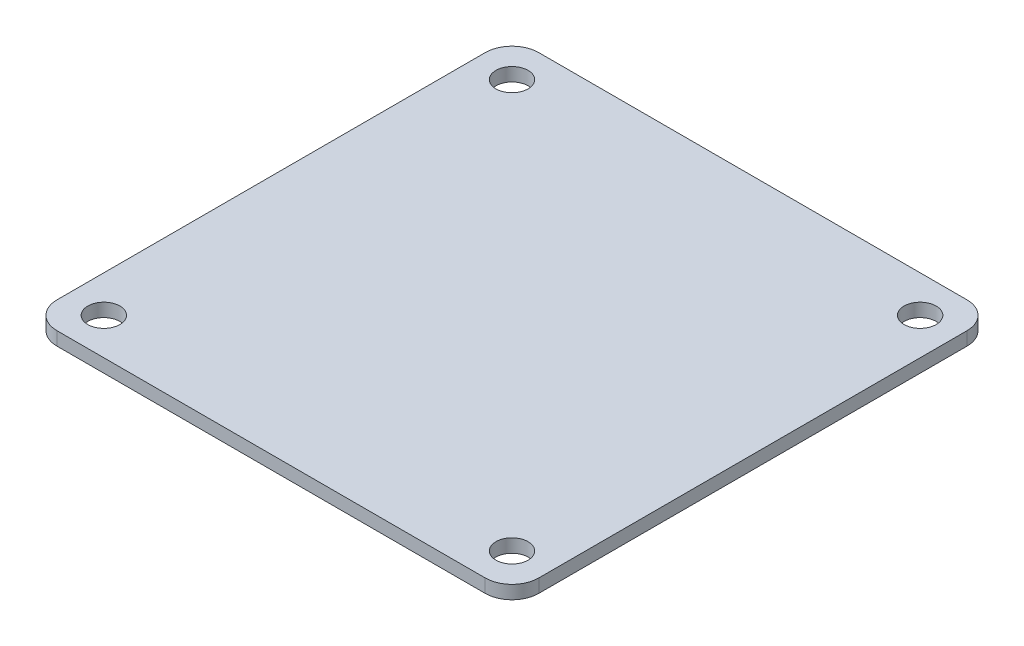
ISO-10303-21;
HEADER;
FILE_DESCRIPTION(('STEP AP214'),'2;1');
FILE_NAME('part.step','',(''),(''),'','','');
FILE_SCHEMA(('AUTOMOTIVE_DESIGN { 1 0 10303 214 1 1 1 1 }'));
ENDSEC;
DATA;
#1=APPLICATION_CONTEXT('core data for automotive mechanical design processes');
#2=APPLICATION_PROTOCOL_DEFINITION('international standard','automotive_design',2000,#1);
#3=PRODUCT_CONTEXT('',#1,'mechanical');
#4=PRODUCT('Part','Part','',(#3));
#5=PRODUCT_RELATED_PRODUCT_CATEGORY('part','',(#4));
#6=PRODUCT_DEFINITION_FORMATION('','',#4);
#7=PRODUCT_DEFINITION_CONTEXT('part definition',#1,'design');
#8=PRODUCT_DEFINITION('design','',#6,#7);
#9=PRODUCT_DEFINITION_SHAPE('','',#8);
#10=(LENGTH_UNIT() NAMED_UNIT(*) SI_UNIT(.MILLI.,.METRE.));
#11=(NAMED_UNIT(*) PLANE_ANGLE_UNIT() SI_UNIT($,.RADIAN.));
#12=(NAMED_UNIT(*) SI_UNIT($,.STERADIAN.) SOLID_ANGLE_UNIT());
#13=UNCERTAINTY_MEASURE_WITH_UNIT(LENGTH_MEASURE(1.E-05),#10,'distance_accuracy_value','');
#14=(GEOMETRIC_REPRESENTATION_CONTEXT(3) GLOBAL_UNCERTAINTY_ASSIGNED_CONTEXT((#13)) GLOBAL_UNIT_ASSIGNED_CONTEXT((#10,
#11,#12)) REPRESENTATION_CONTEXT('',''));
#15=CARTESIAN_POINT('',(0.,0.,0.));
#16=DIRECTION('',(0.,0.,1.));
#17=DIRECTION('',(1.,0.,0.));
#18=AXIS2_PLACEMENT_3D('',#15,#16,#17);
#19=CARTESIAN_POINT('',(-18.,1.,-18.));
#20=DIRECTION('',(1.,0.,0.));
#21=DIRECTION('',(0.,0.,-1.));
#22=AXIS2_PLACEMENT_3D('',#19,#20,#21);
#23=PLANE('',#22);
#24=DIRECTION('',(0.,0.,1.));
#25=VECTOR('',#24,1.);
#26=CARTESIAN_POINT('',(-18.,0.,-18.));
#27=LINE('',#26,#25);
#28=CARTESIAN_POINT('',(-18.,0.,-16.));
#29=VERTEX_POINT('',#28);
#30=CARTESIAN_POINT('',(-18.,0.,16.));
#31=VERTEX_POINT('',#30);
#32=EDGE_CURVE('E158',#29,#31,#27,.T.);
#33=ORIENTED_EDGE('',*,*,#32,.T.);
#34=DIRECTION('',(0.,-1.,0.));
#35=VECTOR('',#34,1.);
#36=CARTESIAN_POINT('',(-18.,1.,16.));
#37=LINE('',#36,#35);
#38=CARTESIAN_POINT('',(-18.,1.,16.));
#39=VERTEX_POINT('',#38);
#40=EDGE_CURVE('E11',#31,#39,#37,.F.);
#41=ORIENTED_EDGE('',*,*,#40,.T.);
#42=DIRECTION('',(0.,0.,1.));
#43=VECTOR('',#42,1.);
#44=CARTESIAN_POINT('',(-18.,1.,-18.));
#45=LINE('',#44,#43);
#46=CARTESIAN_POINT('',(-18.,1.,-16.));
#47=VERTEX_POINT('',#46);
#48=EDGE_CURVE('E126',#47,#39,#45,.T.);
#49=ORIENTED_EDGE('',*,*,#48,.F.);
#50=DIRECTION('',(0.,-1.,0.));
#51=VECTOR('',#50,1.);
#52=CARTESIAN_POINT('',(-18.,1.,-16.));
#53=LINE('',#52,#51);
#54=EDGE_CURVE('E42',#47,#29,#53,.T.);
#55=ORIENTED_EDGE('',*,*,#54,.T.);
#56=EDGE_LOOP('',(#33,#41,#49,#55));
#57=FACE_BOUND('',#56,.T.);
#58=ADVANCED_FACE('F34',(#57),#23,.F.);
#59=CARTESIAN_POINT('',(18.,1.,18.));
#60=DIRECTION('',(0.,0.,-1.));
#61=DIRECTION('',(-1.,0.,0.));
#62=AXIS2_PLACEMENT_3D('',#59,#60,#61);
#63=PLANE('',#62);
#64=DIRECTION('',(1.,0.,0.));
#65=VECTOR('',#64,1.);
#66=CARTESIAN_POINT('',(18.,0.,18.));
#67=LINE('',#66,#65);
#68=CARTESIAN_POINT('',(-16.,0.,18.));
#69=VERTEX_POINT('',#68);
#70=CARTESIAN_POINT('',(16.,0.,18.));
#71=VERTEX_POINT('',#70);
#72=EDGE_CURVE('E131',#69,#71,#67,.T.);
#73=ORIENTED_EDGE('',*,*,#72,.T.);
#74=DIRECTION('',(0.,-1.,0.));
#75=VECTOR('',#74,1.);
#76=CARTESIAN_POINT('',(16.,1.,18.));
#77=LINE('',#76,#75);
#78=CARTESIAN_POINT('',(16.,1.,18.));
#79=VERTEX_POINT('',#78);
#80=EDGE_CURVE('E49',#71,#79,#77,.F.);
#81=ORIENTED_EDGE('',*,*,#80,.T.);
#82=DIRECTION('',(1.,0.,0.));
#83=VECTOR('',#82,1.);
#84=CARTESIAN_POINT('',(18.,1.,18.));
#85=LINE('',#84,#83);
#86=CARTESIAN_POINT('',(-16.,1.,18.));
#87=VERTEX_POINT('',#86);
#88=EDGE_CURVE('E129',#87,#79,#85,.T.);
#89=ORIENTED_EDGE('',*,*,#88,.F.);
#90=DIRECTION('',(0.,-1.,0.));
#91=VECTOR('',#90,1.);
#92=CARTESIAN_POINT('',(-16.,1.,18.));
#93=LINE('',#92,#91);
#94=EDGE_CURVE('E150',#87,#69,#93,.T.);
#95=ORIENTED_EDGE('',*,*,#94,.T.);
#96=EDGE_LOOP('',(#73,#81,#89,#95));
#97=FACE_BOUND('',#96,.T.);
#98=ADVANCED_FACE('F213',(#97),#63,.F.);
#99=CARTESIAN_POINT('',(18.,1.,-18.));
#100=DIRECTION('',(-1.,0.,0.));
#101=DIRECTION('',(0.,0.,1.));
#102=AXIS2_PLACEMENT_3D('',#99,#100,#101);
#103=PLANE('',#102);
#104=DIRECTION('',(0.,0.,-1.));
#105=VECTOR('',#104,1.);
#106=CARTESIAN_POINT('',(18.,0.,-18.));
#107=LINE('',#106,#105);
#108=CARTESIAN_POINT('',(18.,0.,16.));
#109=VERTEX_POINT('',#108);
#110=CARTESIAN_POINT('',(18.,0.,-16.));
#111=VERTEX_POINT('',#110);
#112=EDGE_CURVE('E127',#109,#111,#107,.T.);
#113=ORIENTED_EDGE('',*,*,#112,.T.);
#114=DIRECTION('',(0.,-1.,0.));
#115=VECTOR('',#114,1.);
#116=CARTESIAN_POINT('',(18.,1.,-16.));
#117=LINE('',#116,#115);
#118=CARTESIAN_POINT('',(18.,1.,-16.));
#119=VERTEX_POINT('',#118);
#120=EDGE_CURVE('E105',#111,#119,#117,.F.);
#121=ORIENTED_EDGE('',*,*,#120,.T.);
#122=DIRECTION('',(0.,0.,-1.));
#123=VECTOR('',#122,1.);
#124=CARTESIAN_POINT('',(18.,1.,-18.));
#125=LINE('',#124,#123);
#126=CARTESIAN_POINT('',(18.,1.,16.));
#127=VERTEX_POINT('',#126);
#128=EDGE_CURVE('E170',#127,#119,#125,.T.);
#129=ORIENTED_EDGE('',*,*,#128,.F.);
#130=DIRECTION('',(0.,-1.,0.));
#131=VECTOR('',#130,1.);
#132=CARTESIAN_POINT('',(18.,1.,16.));
#133=LINE('',#132,#131);
#134=EDGE_CURVE('E110',#127,#109,#133,.T.);
#135=ORIENTED_EDGE('',*,*,#134,.T.);
#136=EDGE_LOOP('',(#113,#121,#129,#135));
#137=FACE_BOUND('',#136,.T.);
#138=ADVANCED_FACE('F210',(#137),#103,.F.);
#139=CARTESIAN_POINT('',(18.,1.,-18.));
#140=DIRECTION('',(0.,0.,1.));
#141=DIRECTION('',(1.,0.,0.));
#142=AXIS2_PLACEMENT_3D('',#139,#140,#141);
#143=PLANE('',#142);
#144=DIRECTION('',(-1.,0.,0.));
#145=VECTOR('',#144,1.);
#146=CARTESIAN_POINT('',(18.,1.,-18.));
#147=LINE('',#146,#145);
#148=CARTESIAN_POINT('',(16.,1.,-18.));
#149=VERTEX_POINT('',#148);
#150=CARTESIAN_POINT('',(-16.,1.,-18.));
#151=VERTEX_POINT('',#150);
#152=EDGE_CURVE('E120',#149,#151,#147,.T.);
#153=ORIENTED_EDGE('',*,*,#152,.F.);
#154=DIRECTION('',(0.,-1.,0.));
#155=VECTOR('',#154,1.);
#156=CARTESIAN_POINT('',(16.,1.,-18.));
#157=LINE('',#156,#155);
#158=CARTESIAN_POINT('',(16.,0.,-18.));
#159=VERTEX_POINT('',#158);
#160=EDGE_CURVE('E104',#149,#159,#157,.T.);
#161=ORIENTED_EDGE('',*,*,#160,.T.);
#162=DIRECTION('',(-1.,0.,0.));
#163=VECTOR('',#162,1.);
#164=CARTESIAN_POINT('',(18.,0.,-18.));
#165=LINE('',#164,#163);
#166=CARTESIAN_POINT('',(-16.,0.,-18.));
#167=VERTEX_POINT('',#166);
#168=EDGE_CURVE('E117',#159,#167,#165,.T.);
#169=ORIENTED_EDGE('',*,*,#168,.T.);
#170=DIRECTION('',(0.,-1.,0.));
#171=VECTOR('',#170,1.);
#172=CARTESIAN_POINT('',(-16.,1.,-18.));
#173=LINE('',#172,#171);
#174=EDGE_CURVE('E122',#167,#151,#173,.F.);
#175=ORIENTED_EDGE('',*,*,#174,.T.);
#176=EDGE_LOOP('',(#153,#161,#169,#175));
#177=FACE_BOUND('',#176,.T.);
#178=ADVANCED_FACE('F116',(#177),#143,.F.);
#179=CARTESIAN_POINT('',(0.,1.,0.));
#180=DIRECTION('',(0.,-1.,0.));
#181=DIRECTION('',(0.,0.,-1.));
#182=AXIS2_PLACEMENT_3D('',#179,#180,#181);
#183=PLANE('',#182);
#184=CARTESIAN_POINT('',(-15.25,1.,-15.25));
#185=DIRECTION('',(0.,1.,0.));
#186=DIRECTION('',(0.,0.,1.));
#187=AXIS2_PLACEMENT_3D('',#184,#185,#186);
#188=CIRCLE('',#187,1.19999999999999);
#189=CARTESIAN_POINT('',(-15.25,1.,-14.05));
#190=VERTEX_POINT('',#189);
#191=EDGE_CURVE('E191',#190,#190,#188,.T.);
#192=ORIENTED_EDGE('',*,*,#191,.F.);
#193=EDGE_LOOP('',(#192));
#194=FACE_BOUND('',#193,.T.);
#195=CARTESIAN_POINT('',(15.25,1.,-15.25));
#196=DIRECTION('',(0.,1.,0.));
#197=DIRECTION('',(0.,0.,1.));
#198=AXIS2_PLACEMENT_3D('',#195,#196,#197);
#199=CIRCLE('',#198,1.19999999999999);
#200=CARTESIAN_POINT('',(15.25,1.,-14.05));
#201=VERTEX_POINT('',#200);
#202=EDGE_CURVE('E185',#201,#201,#199,.T.);
#203=ORIENTED_EDGE('',*,*,#202,.F.);
#204=EDGE_LOOP('',(#203));
#205=FACE_BOUND('',#204,.T.);
#206=CARTESIAN_POINT('',(15.25,1.,15.25));
#207=DIRECTION('',(0.,1.,0.));
#208=DIRECTION('',(0.,0.,1.));
#209=AXIS2_PLACEMENT_3D('',#206,#207,#208);
#210=CIRCLE('',#209,1.19999999999999);
#211=CARTESIAN_POINT('',(15.25,1.,16.45));
#212=VERTEX_POINT('',#211);
#213=EDGE_CURVE('E179',#212,#212,#210,.T.);
#214=ORIENTED_EDGE('',*,*,#213,.F.);
#215=EDGE_LOOP('',(#214));
#216=FACE_BOUND('',#215,.T.);
#217=CARTESIAN_POINT('',(-15.25,1.,15.25));
#218=DIRECTION('',(0.,1.,0.));
#219=DIRECTION('',(0.,0.,1.));
#220=AXIS2_PLACEMENT_3D('',#217,#218,#219);
#221=CIRCLE('',#220,1.19999999999999);
#222=CARTESIAN_POINT('',(-15.25,1.,16.45));
#223=VERTEX_POINT('',#222);
#224=EDGE_CURVE('E166',#223,#223,#221,.T.);
#225=ORIENTED_EDGE('',*,*,#224,.F.);
#226=EDGE_LOOP('',(#225));
#227=FACE_BOUND('',#226,.T.);
#228=ORIENTED_EDGE('',*,*,#128,.T.);
#229=CARTESIAN_POINT('',(16.,1.,-16.));
#230=DIRECTION('',(0.,-1.,0.));
#231=DIRECTION('',(0.,0.,-1.));
#232=AXIS2_PLACEMENT_3D('',#229,#230,#231);
#233=CIRCLE('',#232,2.);
#234=EDGE_CURVE('E148',#119,#149,#233,.F.);
#235=ORIENTED_EDGE('',*,*,#234,.T.);
#236=ORIENTED_EDGE('',*,*,#152,.T.);
#237=CARTESIAN_POINT('',(-16.,1.,-16.));
#238=DIRECTION('',(0.,-1.,0.));
#239=DIRECTION('',(0.,0.,-1.));
#240=AXIS2_PLACEMENT_3D('',#237,#238,#239);
#241=CIRCLE('',#240,2.);
#242=EDGE_CURVE('E143',#151,#47,#241,.F.);
#243=ORIENTED_EDGE('',*,*,#242,.T.);
#244=ORIENTED_EDGE('',*,*,#48,.T.);
#245=CARTESIAN_POINT('',(-16.,1.,16.));
#246=DIRECTION('',(0.,-1.,0.));
#247=DIRECTION('',(0.,0.,-1.));
#248=AXIS2_PLACEMENT_3D('',#245,#246,#247);
#249=CIRCLE('',#248,2.);
#250=EDGE_CURVE('E56',#39,#87,#249,.F.);
#251=ORIENTED_EDGE('',*,*,#250,.T.);
#252=ORIENTED_EDGE('',*,*,#88,.T.);
#253=CARTESIAN_POINT('',(16.,1.,16.));
#254=DIRECTION('',(0.,-1.,0.));
#255=DIRECTION('',(0.,0.,-1.));
#256=AXIS2_PLACEMENT_3D('',#253,#254,#255);
#257=CIRCLE('',#256,2.);
#258=EDGE_CURVE('E146',#79,#127,#257,.F.);
#259=ORIENTED_EDGE('',*,*,#258,.T.);
#260=EDGE_LOOP('',(#228,#235,#236,#243,#244,#251,#252,#259));
#261=FACE_BOUND('',#260,.T.);
#262=ADVANCED_FACE('F197',(#194,#205,#216,#227,#261),#183,.F.);
#263=CARTESIAN_POINT('',(0.,0.,0.));
#264=DIRECTION('',(0.,-1.,0.));
#265=DIRECTION('',(0.,0.,-1.));
#266=AXIS2_PLACEMENT_3D('',#263,#264,#265);
#267=PLANE('',#266);
#268=CARTESIAN_POINT('',(-15.25,0.,-15.25));
#269=DIRECTION('',(0.,1.,0.));
#270=DIRECTION('',(0.,0.,1.));
#271=AXIS2_PLACEMENT_3D('',#268,#269,#270);
#272=CIRCLE('',#271,1.2);
#273=CARTESIAN_POINT('',(-15.25,0.,-14.05));
#274=VERTEX_POINT('',#273);
#275=EDGE_CURVE('E188',#274,#274,#272,.T.);
#276=ORIENTED_EDGE('',*,*,#275,.T.);
#277=EDGE_LOOP('',(#276));
#278=FACE_BOUND('',#277,.T.);
#279=CARTESIAN_POINT('',(15.25,0.,-15.25));
#280=DIRECTION('',(0.,1.,0.));
#281=DIRECTION('',(0.,0.,1.));
#282=AXIS2_PLACEMENT_3D('',#279,#280,#281);
#283=CIRCLE('',#282,1.2);
#284=CARTESIAN_POINT('',(15.25,0.,-14.05));
#285=VERTEX_POINT('',#284);
#286=EDGE_CURVE('E182',#285,#285,#283,.T.);
#287=ORIENTED_EDGE('',*,*,#286,.T.);
#288=EDGE_LOOP('',(#287));
#289=FACE_BOUND('',#288,.T.);
#290=CARTESIAN_POINT('',(15.25,0.,15.25));
#291=DIRECTION('',(0.,1.,0.));
#292=DIRECTION('',(0.,0.,1.));
#293=AXIS2_PLACEMENT_3D('',#290,#291,#292);
#294=CIRCLE('',#293,1.2);
#295=CARTESIAN_POINT('',(15.25,0.,16.45));
#296=VERTEX_POINT('',#295);
#297=EDGE_CURVE('E176',#296,#296,#294,.T.);
#298=ORIENTED_EDGE('',*,*,#297,.T.);
#299=EDGE_LOOP('',(#298));
#300=FACE_BOUND('',#299,.T.);
#301=CARTESIAN_POINT('',(-15.25,0.,15.25));
#302=DIRECTION('',(0.,1.,0.));
#303=DIRECTION('',(0.,0.,1.));
#304=AXIS2_PLACEMENT_3D('',#301,#302,#303);
#305=CIRCLE('',#304,1.2);
#306=CARTESIAN_POINT('',(-15.25,0.,16.45));
#307=VERTEX_POINT('',#306);
#308=EDGE_CURVE('E163',#307,#307,#305,.T.);
#309=ORIENTED_EDGE('',*,*,#308,.T.);
#310=EDGE_LOOP('',(#309));
#311=FACE_BOUND('',#310,.T.);
#312=ORIENTED_EDGE('',*,*,#168,.F.);
#313=CARTESIAN_POINT('',(16.,0.,-16.));
#314=DIRECTION('',(0.,-1.,0.));
#315=DIRECTION('',(0.,0.,-1.));
#316=AXIS2_PLACEMENT_3D('',#313,#314,#315);
#317=CIRCLE('',#316,2.);
#318=EDGE_CURVE('E100',#159,#111,#317,.T.);
#319=ORIENTED_EDGE('',*,*,#318,.T.);
#320=ORIENTED_EDGE('',*,*,#112,.F.);
#321=CARTESIAN_POINT('',(16.,0.,16.));
#322=DIRECTION('',(0.,-1.,0.));
#323=DIRECTION('',(0.,0.,-1.));
#324=AXIS2_PLACEMENT_3D('',#321,#322,#323);
#325=CIRCLE('',#324,2.);
#326=EDGE_CURVE('E111',#109,#71,#325,.T.);
#327=ORIENTED_EDGE('',*,*,#326,.T.);
#328=ORIENTED_EDGE('',*,*,#72,.F.);
#329=CARTESIAN_POINT('',(-16.,0.,16.));
#330=DIRECTION('',(0.,-1.,0.));
#331=DIRECTION('',(0.,0.,-1.));
#332=AXIS2_PLACEMENT_3D('',#329,#330,#331);
#333=CIRCLE('',#332,2.);
#334=EDGE_CURVE('E137',#69,#31,#333,.T.);
#335=ORIENTED_EDGE('',*,*,#334,.T.);
#336=ORIENTED_EDGE('',*,*,#32,.F.);
#337=CARTESIAN_POINT('',(-16.,0.,-16.));
#338=DIRECTION('',(0.,-1.,0.));
#339=DIRECTION('',(0.,0.,-1.));
#340=AXIS2_PLACEMENT_3D('',#337,#338,#339);
#341=CIRCLE('',#340,2.);
#342=EDGE_CURVE('E121',#29,#167,#341,.T.);
#343=ORIENTED_EDGE('',*,*,#342,.T.);
#344=EDGE_LOOP('',(#312,#319,#320,#327,#328,#335,#336,#343));
#345=FACE_BOUND('',#344,.T.);
#346=ADVANCED_FACE('F124',(#278,#289,#300,#311,#345),#267,.T.);
#347=CARTESIAN_POINT('',(-15.25,1.,15.25));
#348=DIRECTION('',(0.,1.,0.));
#349=DIRECTION('',(0.,0.,1.));
#350=AXIS2_PLACEMENT_3D('',#347,#348,#349);
#351=CYLINDRICAL_SURFACE('',#350,1.19999999999999);
#352=ORIENTED_EDGE('',*,*,#308,.F.);
#353=EDGE_LOOP('',(#352));
#354=FACE_BOUND('',#353,.T.);
#355=ORIENTED_EDGE('',*,*,#224,.T.);
#356=EDGE_LOOP('',(#355));
#357=FACE_BOUND('',#356,.T.);
#358=ADVANCED_FACE('F279',(#354,#357),#351,.F.);
#359=CARTESIAN_POINT('',(15.25,1.,15.25));
#360=DIRECTION('',(0.,1.,0.));
#361=DIRECTION('',(0.,0.,1.));
#362=AXIS2_PLACEMENT_3D('',#359,#360,#361);
#363=CYLINDRICAL_SURFACE('',#362,1.19999999999999);
#364=ORIENTED_EDGE('',*,*,#297,.F.);
#365=EDGE_LOOP('',(#364));
#366=FACE_BOUND('',#365,.T.);
#367=ORIENTED_EDGE('',*,*,#213,.T.);
#368=EDGE_LOOP('',(#367));
#369=FACE_BOUND('',#368,.T.);
#370=ADVANCED_FACE('F270',(#366,#369),#363,.F.);
#371=CARTESIAN_POINT('',(15.25,1.,-15.25));
#372=DIRECTION('',(0.,1.,0.));
#373=DIRECTION('',(0.,0.,1.));
#374=AXIS2_PLACEMENT_3D('',#371,#372,#373);
#375=CYLINDRICAL_SURFACE('',#374,1.19999999999999);
#376=ORIENTED_EDGE('',*,*,#286,.F.);
#377=EDGE_LOOP('',(#376));
#378=FACE_BOUND('',#377,.T.);
#379=ORIENTED_EDGE('',*,*,#202,.T.);
#380=EDGE_LOOP('',(#379));
#381=FACE_BOUND('',#380,.T.);
#382=ADVANCED_FACE('F261',(#378,#381),#375,.F.);
#383=CARTESIAN_POINT('',(-15.25,1.,-15.25));
#384=DIRECTION('',(0.,1.,0.));
#385=DIRECTION('',(0.,0.,1.));
#386=AXIS2_PLACEMENT_3D('',#383,#384,#385);
#387=CYLINDRICAL_SURFACE('',#386,1.19999999999999);
#388=ORIENTED_EDGE('',*,*,#275,.F.);
#389=EDGE_LOOP('',(#388));
#390=FACE_BOUND('',#389,.T.);
#391=ORIENTED_EDGE('',*,*,#191,.T.);
#392=EDGE_LOOP('',(#391));
#393=FACE_BOUND('',#392,.T.);
#394=ADVANCED_FACE('F195',(#390,#393),#387,.F.);
#395=CARTESIAN_POINT('',(16.,1.,-16.));
#396=DIRECTION('',(0.,-1.,0.));
#397=DIRECTION('',(0.,0.,-1.));
#398=AXIS2_PLACEMENT_3D('',#395,#396,#397);
#399=CYLINDRICAL_SURFACE('',#398,2.);
#400=ORIENTED_EDGE('',*,*,#234,.F.);
#401=ORIENTED_EDGE('',*,*,#120,.F.);
#402=ORIENTED_EDGE('',*,*,#318,.F.);
#403=ORIENTED_EDGE('',*,*,#160,.F.);
#404=EDGE_LOOP('',(#400,#401,#402,#403));
#405=FACE_BOUND('',#404,.T.);
#406=ADVANCED_FACE('F103',(#405),#399,.T.);
#407=CARTESIAN_POINT('',(16.,1.,16.));
#408=DIRECTION('',(0.,-1.,0.));
#409=DIRECTION('',(0.,0.,-1.));
#410=AXIS2_PLACEMENT_3D('',#407,#408,#409);
#411=CYLINDRICAL_SURFACE('',#410,2.);
#412=ORIENTED_EDGE('',*,*,#258,.F.);
#413=ORIENTED_EDGE('',*,*,#80,.F.);
#414=ORIENTED_EDGE('',*,*,#326,.F.);
#415=ORIENTED_EDGE('',*,*,#134,.F.);
#416=EDGE_LOOP('',(#412,#413,#414,#415));
#417=FACE_BOUND('',#416,.T.);
#418=ADVANCED_FACE('F212',(#417),#411,.T.);
#419=CARTESIAN_POINT('',(-16.,1.,16.));
#420=DIRECTION('',(0.,-1.,0.));
#421=DIRECTION('',(0.,0.,-1.));
#422=AXIS2_PLACEMENT_3D('',#419,#420,#421);
#423=CYLINDRICAL_SURFACE('',#422,2.);
#424=ORIENTED_EDGE('',*,*,#250,.F.);
#425=ORIENTED_EDGE('',*,*,#40,.F.);
#426=ORIENTED_EDGE('',*,*,#334,.F.);
#427=ORIENTED_EDGE('',*,*,#94,.F.);
#428=EDGE_LOOP('',(#424,#425,#426,#427));
#429=FACE_BOUND('',#428,.T.);
#430=ADVANCED_FACE('F216',(#429),#423,.T.);
#431=CARTESIAN_POINT('',(-16.,1.,-16.));
#432=DIRECTION('',(0.,-1.,0.));
#433=DIRECTION('',(0.,0.,-1.));
#434=AXIS2_PLACEMENT_3D('',#431,#432,#433);
#435=CYLINDRICAL_SURFACE('',#434,2.);
#436=ORIENTED_EDGE('',*,*,#242,.F.);
#437=ORIENTED_EDGE('',*,*,#174,.F.);
#438=ORIENTED_EDGE('',*,*,#342,.F.);
#439=ORIENTED_EDGE('',*,*,#54,.F.);
#440=EDGE_LOOP('',(#436,#437,#438,#439));
#441=FACE_BOUND('',#440,.T.);
#442=ADVANCED_FACE('F36',(#441),#435,.T.);
#443=CLOSED_SHELL('',(#58,#98,#138,#178,#262,#346,#358,#370,#382,#394,#406,#418,#430,#442));
#444=MANIFOLD_SOLID_BREP('B2',#443);
#445=ADVANCED_BREP_SHAPE_REPRESENTATION('',(#18,#444),#14);
#446=SHAPE_DEFINITION_REPRESENTATION(#9,#445);
ENDSEC;
END-ISO-10303-21;
